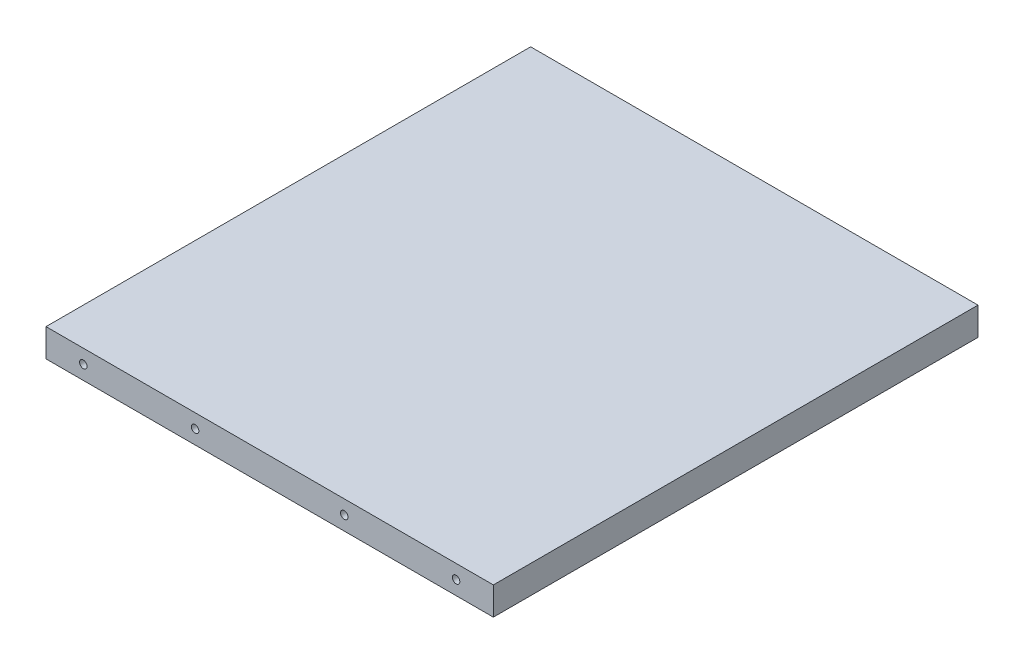
ISO-10303-21;
HEADER;
FILE_DESCRIPTION(('STEP AP214'),'2;1');
FILE_NAME('part.step','',(''),(''),'','','');
FILE_SCHEMA(('AUTOMOTIVE_DESIGN { 1 0 10303 214 1 1 1 1 }'));
ENDSEC;
DATA;
#1=APPLICATION_CONTEXT('core data for automotive mechanical design processes');
#2=APPLICATION_PROTOCOL_DEFINITION('international standard','automotive_design',2000,#1);
#3=PRODUCT_CONTEXT('',#1,'mechanical');
#4=PRODUCT('Part','Part','',(#3));
#5=PRODUCT_RELATED_PRODUCT_CATEGORY('part','',(#4));
#6=PRODUCT_DEFINITION_FORMATION('','',#4);
#7=PRODUCT_DEFINITION_CONTEXT('part definition',#1,'design');
#8=PRODUCT_DEFINITION('design','',#6,#7);
#9=PRODUCT_DEFINITION_SHAPE('','',#8);
#10=(LENGTH_UNIT() NAMED_UNIT(*) SI_UNIT(.MILLI.,.METRE.));
#11=(NAMED_UNIT(*) PLANE_ANGLE_UNIT() SI_UNIT($,.RADIAN.));
#12=(NAMED_UNIT(*) SI_UNIT($,.STERADIAN.) SOLID_ANGLE_UNIT());
#13=UNCERTAINTY_MEASURE_WITH_UNIT(LENGTH_MEASURE(1.E-05),#10,'distance_accuracy_value','');
#14=(GEOMETRIC_REPRESENTATION_CONTEXT(3) GLOBAL_UNCERTAINTY_ASSIGNED_CONTEXT((#13)) GLOBAL_UNIT_ASSIGNED_CONTEXT((#10,
#11,#12)) REPRESENTATION_CONTEXT('',''));
#15=CARTESIAN_POINT('',(0.,0.,0.));
#16=DIRECTION('',(0.,0.,1.));
#17=DIRECTION('',(1.,0.,0.));
#18=AXIS2_PLACEMENT_3D('',#15,#16,#17);
#19=CARTESIAN_POINT('',(152.4,9.525,165.1));
#20=DIRECTION('',(-1.,0.,0.));
#21=DIRECTION('',(0.,0.,1.));
#22=AXIS2_PLACEMENT_3D('',#19,#20,#21);
#23=PLANE('',#22);
#24=DIRECTION('',(0.,0.,-1.));
#25=VECTOR('',#24,1.);
#26=CARTESIAN_POINT('',(152.4,-9.525,165.1));
#27=LINE('',#26,#25);
#28=CARTESIAN_POINT('',(152.4,-9.525,165.1));
#29=VERTEX_POINT('',#28);
#30=CARTESIAN_POINT('',(152.4,-9.525,-165.1));
#31=VERTEX_POINT('',#30);
#32=EDGE_CURVE('E144',#29,#31,#27,.T.);
#33=ORIENTED_EDGE('',*,*,#32,.T.);
#34=DIRECTION('',(0.,-1.,0.));
#35=VECTOR('',#34,1.);
#36=CARTESIAN_POINT('',(152.4,9.525,-165.1));
#37=LINE('',#36,#35);
#38=CARTESIAN_POINT('',(152.4,9.525,-165.1));
#39=VERTEX_POINT('',#38);
#40=EDGE_CURVE('E11',#39,#31,#37,.T.);
#41=ORIENTED_EDGE('',*,*,#40,.F.);
#42=DIRECTION('',(0.,0.,-1.));
#43=VECTOR('',#42,1.);
#44=CARTESIAN_POINT('',(152.4,9.525,165.1));
#45=LINE('',#44,#43);
#46=CARTESIAN_POINT('',(152.4,9.525,165.1));
#47=VERTEX_POINT('',#46);
#48=EDGE_CURVE('E145',#47,#39,#45,.T.);
#49=ORIENTED_EDGE('',*,*,#48,.F.);
#50=DIRECTION('',(0.,-1.,0.));
#51=VECTOR('',#50,1.);
#52=CARTESIAN_POINT('',(152.4,9.525,165.1));
#53=LINE('',#52,#51);
#54=EDGE_CURVE('E155',#47,#29,#53,.T.);
#55=ORIENTED_EDGE('',*,*,#54,.T.);
#56=EDGE_LOOP('',(#33,#41,#49,#55));
#57=FACE_BOUND('',#56,.T.);
#58=ADVANCED_FACE('F42',(#57),#23,.F.);
#59=CARTESIAN_POINT('',(-152.4,9.525,-165.1));
#60=DIRECTION('',(0.,0.,1.));
#61=DIRECTION('',(1.,0.,0.));
#62=AXIS2_PLACEMENT_3D('',#59,#60,#61);
#63=PLANE('',#62);
#64=DIRECTION('',(-1.,0.,0.));
#65=VECTOR('',#64,1.);
#66=CARTESIAN_POINT('',(-152.4,-9.525,-165.1));
#67=LINE('',#66,#65);
#68=CARTESIAN_POINT('',(-152.4,-9.525,-165.1));
#69=VERTEX_POINT('',#68);
#70=EDGE_CURVE('E159',#31,#69,#67,.T.);
#71=ORIENTED_EDGE('',*,*,#70,.T.);
#72=DIRECTION('',(0.,-1.,0.));
#73=VECTOR('',#72,1.);
#74=CARTESIAN_POINT('',(-152.4,9.525,-165.1));
#75=LINE('',#74,#73);
#76=CARTESIAN_POINT('',(-152.4,9.525,-165.1));
#77=VERTEX_POINT('',#76);
#78=EDGE_CURVE('E51',#77,#69,#75,.T.);
#79=ORIENTED_EDGE('',*,*,#78,.F.);
#80=DIRECTION('',(-1.,0.,0.));
#81=VECTOR('',#80,1.);
#82=CARTESIAN_POINT('',(-152.4,9.525,-165.1));
#83=LINE('',#82,#81);
#84=EDGE_CURVE('E90',#39,#77,#83,.T.);
#85=ORIENTED_EDGE('',*,*,#84,.F.);
#86=ORIENTED_EDGE('',*,*,#40,.T.);
#87=EDGE_LOOP('',(#71,#79,#85,#86));
#88=FACE_BOUND('',#87,.T.);
#89=ADVANCED_FACE('F189',(#88),#63,.F.);
#90=CARTESIAN_POINT('',(-152.4,9.525,165.1));
#91=DIRECTION('',(1.,0.,0.));
#92=DIRECTION('',(0.,0.,-1.));
#93=AXIS2_PLACEMENT_3D('',#90,#91,#92);
#94=PLANE('',#93);
#95=DIRECTION('',(0.,0.,1.));
#96=VECTOR('',#95,1.);
#97=CARTESIAN_POINT('',(-152.4,-9.525,165.1));
#98=LINE('',#97,#96);
#99=CARTESIAN_POINT('',(-152.4,-9.525,165.1));
#100=VERTEX_POINT('',#99);
#101=EDGE_CURVE('E77',#69,#100,#98,.T.);
#102=ORIENTED_EDGE('',*,*,#101,.T.);
#103=DIRECTION('',(0.,-1.,0.));
#104=VECTOR('',#103,1.);
#105=CARTESIAN_POINT('',(-152.4,9.525,165.1));
#106=LINE('',#105,#104);
#107=CARTESIAN_POINT('',(-152.4,9.525,165.1));
#108=VERTEX_POINT('',#107);
#109=EDGE_CURVE('E168',#108,#100,#106,.T.);
#110=ORIENTED_EDGE('',*,*,#109,.F.);
#111=DIRECTION('',(0.,0.,1.));
#112=VECTOR('',#111,1.);
#113=CARTESIAN_POINT('',(-152.4,9.525,165.1));
#114=LINE('',#113,#112);
#115=EDGE_CURVE('E150',#77,#108,#114,.T.);
#116=ORIENTED_EDGE('',*,*,#115,.F.);
#117=ORIENTED_EDGE('',*,*,#78,.T.);
#118=EDGE_LOOP('',(#102,#110,#116,#117));
#119=FACE_BOUND('',#118,.T.);
#120=ADVANCED_FACE('F172',(#119),#94,.F.);
#121=CARTESIAN_POINT('',(-152.4,9.525,165.1));
#122=DIRECTION('',(0.,0.,-1.));
#123=DIRECTION('',(-1.,0.,0.));
#124=AXIS2_PLACEMENT_3D('',#121,#122,#123);
#125=PLANE('',#124);
#126=CARTESIAN_POINT('',(127.,0.,165.1));
#127=DIRECTION('',(0.,0.,1.));
#128=DIRECTION('',(1.,0.,0.));
#129=AXIS2_PLACEMENT_3D('',#126,#127,#128);
#130=CIRCLE('',#129,2.55269999999999);
#131=CARTESIAN_POINT('',(129.5527,0.,165.1));
#132=VERTEX_POINT('',#131);
#133=EDGE_CURVE('E115',#132,#132,#130,.T.);
#134=ORIENTED_EDGE('',*,*,#133,.F.);
#135=EDGE_LOOP('',(#134));
#136=FACE_BOUND('',#135,.T.);
#137=CARTESIAN_POINT('',(50.8,0.,165.1));
#138=DIRECTION('',(0.,0.,1.));
#139=DIRECTION('',(1.,0.,0.));
#140=AXIS2_PLACEMENT_3D('',#137,#138,#139);
#141=CIRCLE('',#140,2.55269999999999);
#142=CARTESIAN_POINT('',(53.3527,0.,165.1));
#143=VERTEX_POINT('',#142);
#144=EDGE_CURVE('E114',#143,#143,#141,.T.);
#145=ORIENTED_EDGE('',*,*,#144,.F.);
#146=EDGE_LOOP('',(#145));
#147=FACE_BOUND('',#146,.T.);
#148=CARTESIAN_POINT('',(-50.8,0.,165.1));
#149=DIRECTION('',(0.,0.,1.));
#150=DIRECTION('',(1.,0.,0.));
#151=AXIS2_PLACEMENT_3D('',#148,#149,#150);
#152=CIRCLE('',#151,2.55269999999999);
#153=CARTESIAN_POINT('',(-48.2473,0.,165.1));
#154=VERTEX_POINT('',#153);
#155=EDGE_CURVE('E128',#154,#154,#152,.T.);
#156=ORIENTED_EDGE('',*,*,#155,.F.);
#157=EDGE_LOOP('',(#156));
#158=FACE_BOUND('',#157,.T.);
#159=CARTESIAN_POINT('',(-127.,0.,165.1));
#160=DIRECTION('',(0.,0.,1.));
#161=DIRECTION('',(1.,0.,0.));
#162=AXIS2_PLACEMENT_3D('',#159,#160,#161);
#163=CIRCLE('',#162,2.55269999999999);
#164=CARTESIAN_POINT('',(-124.4473,0.,165.1));
#165=VERTEX_POINT('',#164);
#166=EDGE_CURVE('E136',#165,#165,#163,.T.);
#167=ORIENTED_EDGE('',*,*,#166,.F.);
#168=EDGE_LOOP('',(#167));
#169=FACE_BOUND('',#168,.T.);
#170=DIRECTION('',(1.,0.,0.));
#171=VECTOR('',#170,1.);
#172=CARTESIAN_POINT('',(-152.4,-9.525,165.1));
#173=LINE('',#172,#171);
#174=EDGE_CURVE('E83',#100,#29,#173,.T.);
#175=ORIENTED_EDGE('',*,*,#174,.T.);
#176=ORIENTED_EDGE('',*,*,#54,.F.);
#177=DIRECTION('',(1.,0.,0.));
#178=VECTOR('',#177,1.);
#179=CARTESIAN_POINT('',(-152.4,9.525,165.1));
#180=LINE('',#179,#178);
#181=EDGE_CURVE('E59',#108,#47,#180,.T.);
#182=ORIENTED_EDGE('',*,*,#181,.F.);
#183=ORIENTED_EDGE('',*,*,#109,.T.);
#184=EDGE_LOOP('',(#175,#176,#182,#183));
#185=FACE_BOUND('',#184,.T.);
#186=ADVANCED_FACE('F179',(#136,#147,#158,#169,#185),#125,.F.);
#187=CARTESIAN_POINT('',(0.,9.525,0.));
#188=DIRECTION('',(0.,-1.,0.));
#189=DIRECTION('',(0.,0.,-1.));
#190=AXIS2_PLACEMENT_3D('',#187,#188,#189);
#191=PLANE('',#190);
#192=ORIENTED_EDGE('',*,*,#48,.T.);
#193=ORIENTED_EDGE('',*,*,#84,.T.);
#194=ORIENTED_EDGE('',*,*,#115,.T.);
#195=ORIENTED_EDGE('',*,*,#181,.T.);
#196=EDGE_LOOP('',(#192,#193,#194,#195));
#197=FACE_BOUND('',#196,.T.);
#198=ADVANCED_FACE('F181',(#197),#191,.F.);
#199=CARTESIAN_POINT('',(0.,-9.525,0.));
#200=DIRECTION('',(0.,-1.,0.));
#201=DIRECTION('',(0.,0.,-1.));
#202=AXIS2_PLACEMENT_3D('',#199,#200,#201);
#203=PLANE('',#202);
#204=ORIENTED_EDGE('',*,*,#32,.F.);
#205=ORIENTED_EDGE('',*,*,#174,.F.);
#206=ORIENTED_EDGE('',*,*,#101,.F.);
#207=ORIENTED_EDGE('',*,*,#70,.F.);
#208=EDGE_LOOP('',(#204,#205,#206,#207));
#209=FACE_BOUND('',#208,.T.);
#210=ADVANCED_FACE('F175',(#209),#203,.T.);
#211=CARTESIAN_POINT('',(-127.,0.,127.));
#212=DIRECTION('',(0.,0.,1.));
#213=DIRECTION('',(1.,0.,0.));
#214=AXIS2_PLACEMENT_3D('',#211,#212,#213);
#215=CONICAL_SURFACE('',#214,2.55269999999995,1.02974425867664);
#216=CARTESIAN_POINT('',(-127.,0.,125.466183097808));
#217=VERTEX_POINT('',#216);
#218=VERTEX_LOOP('',#217);
#219=FACE_BOUND('',#218,.T.);
#220=CARTESIAN_POINT('',(-127.,0.,127.));
#221=DIRECTION('',(0.,0.,1.));
#222=DIRECTION('',(1.,0.,0.));
#223=AXIS2_PLACEMENT_3D('',#220,#221,#222);
#224=CIRCLE('',#223,2.55269999999995);
#225=CARTESIAN_POINT('',(-124.4473,0.,127.));
#226=VERTEX_POINT('',#225);
#227=EDGE_CURVE('E140',#226,#226,#224,.T.);
#228=ORIENTED_EDGE('',*,*,#227,.T.);
#229=EDGE_LOOP('',(#228));
#230=FACE_BOUND('',#229,.T.);
#231=ADVANCED_FACE('F220',(#219,#230),#215,.F.);
#232=CARTESIAN_POINT('',(-127.,0.,165.1));
#233=DIRECTION('',(0.,0.,1.));
#234=DIRECTION('',(1.,0.,0.));
#235=AXIS2_PLACEMENT_3D('',#232,#233,#234);
#236=CYLINDRICAL_SURFACE('',#235,2.55269999999997);
#237=ORIENTED_EDGE('',*,*,#227,.F.);
#238=EDGE_LOOP('',(#237));
#239=FACE_BOUND('',#238,.T.);
#240=ORIENTED_EDGE('',*,*,#166,.T.);
#241=EDGE_LOOP('',(#240));
#242=FACE_BOUND('',#241,.T.);
#243=ADVANCED_FACE('F236',(#239,#242),#236,.F.);
#244=CARTESIAN_POINT('',(-50.8,0.,127.));
#245=DIRECTION('',(0.,0.,1.));
#246=DIRECTION('',(1.,0.,0.));
#247=AXIS2_PLACEMENT_3D('',#244,#245,#246);
#248=CONICAL_SURFACE('',#247,2.55269999999996,1.02974425867664);
#249=CARTESIAN_POINT('',(-50.8,0.,125.466183097808));
#250=VERTEX_POINT('',#249);
#251=VERTEX_LOOP('',#250);
#252=FACE_BOUND('',#251,.T.);
#253=CARTESIAN_POINT('',(-50.8,0.,127.));
#254=DIRECTION('',(0.,0.,1.));
#255=DIRECTION('',(1.,0.,0.));
#256=AXIS2_PLACEMENT_3D('',#253,#254,#255);
#257=CIRCLE('',#256,2.55269999999996);
#258=CARTESIAN_POINT('',(-48.2473000000001,0.,127.));
#259=VERTEX_POINT('',#258);
#260=EDGE_CURVE('E132',#259,#259,#257,.T.);
#261=ORIENTED_EDGE('',*,*,#260,.T.);
#262=EDGE_LOOP('',(#261));
#263=FACE_BOUND('',#262,.T.);
#264=ADVANCED_FACE('F247',(#252,#263),#248,.F.);
#265=CARTESIAN_POINT('',(-50.8,0.,165.1));
#266=DIRECTION('',(0.,0.,1.));
#267=DIRECTION('',(1.,0.,0.));
#268=AXIS2_PLACEMENT_3D('',#265,#266,#267);
#269=CYLINDRICAL_SURFACE('',#268,2.55269999999997);
#270=ORIENTED_EDGE('',*,*,#260,.F.);
#271=EDGE_LOOP('',(#270));
#272=FACE_BOUND('',#271,.T.);
#273=ORIENTED_EDGE('',*,*,#155,.T.);
#274=EDGE_LOOP('',(#273));
#275=FACE_BOUND('',#274,.T.);
#276=ADVANCED_FACE('F258',(#272,#275),#269,.F.);
#277=CARTESIAN_POINT('',(50.8,0.,127.));
#278=DIRECTION('',(0.,0.,1.));
#279=DIRECTION('',(1.,0.,0.));
#280=AXIS2_PLACEMENT_3D('',#277,#278,#279);
#281=CONICAL_SURFACE('',#280,2.55269999999996,1.02974425867664);
#282=CARTESIAN_POINT('',(50.8,0.,125.466183097808));
#283=VERTEX_POINT('',#282);
#284=VERTEX_LOOP('',#283);
#285=FACE_BOUND('',#284,.T.);
#286=CARTESIAN_POINT('',(50.8,0.,127.));
#287=DIRECTION('',(0.,0.,1.));
#288=DIRECTION('',(1.,0.,0.));
#289=AXIS2_PLACEMENT_3D('',#286,#287,#288);
#290=CIRCLE('',#289,2.55269999999996);
#291=CARTESIAN_POINT('',(53.3526999999999,0.,127.));
#292=VERTEX_POINT('',#291);
#293=EDGE_CURVE('E120',#292,#292,#290,.T.);
#294=ORIENTED_EDGE('',*,*,#293,.T.);
#295=EDGE_LOOP('',(#294));
#296=FACE_BOUND('',#295,.T.);
#297=ADVANCED_FACE('F268',(#285,#296),#281,.F.);
#298=CARTESIAN_POINT('',(50.8,0.,165.1));
#299=DIRECTION('',(0.,0.,1.));
#300=DIRECTION('',(1.,0.,0.));
#301=AXIS2_PLACEMENT_3D('',#298,#299,#300);
#302=CYLINDRICAL_SURFACE('',#301,2.55269999999997);
#303=ORIENTED_EDGE('',*,*,#293,.F.);
#304=EDGE_LOOP('',(#303));
#305=FACE_BOUND('',#304,.T.);
#306=ORIENTED_EDGE('',*,*,#144,.T.);
#307=EDGE_LOOP('',(#306));
#308=FACE_BOUND('',#307,.T.);
#309=ADVANCED_FACE('F107',(#305,#308),#302,.F.);
#310=CARTESIAN_POINT('',(127.,0.,127.));
#311=DIRECTION('',(0.,0.,1.));
#312=DIRECTION('',(1.,0.,0.));
#313=AXIS2_PLACEMENT_3D('',#310,#311,#312);
#314=CONICAL_SURFACE('',#313,2.55269999999996,1.02974425867664);
#315=CARTESIAN_POINT('',(127.,0.,125.466183097808));
#316=VERTEX_POINT('',#315);
#317=VERTEX_LOOP('',#316);
#318=FACE_BOUND('',#317,.T.);
#319=CARTESIAN_POINT('',(127.,0.,127.));
#320=DIRECTION('',(0.,0.,1.));
#321=DIRECTION('',(1.,0.,0.));
#322=AXIS2_PLACEMENT_3D('',#319,#320,#321);
#323=CIRCLE('',#322,2.55269999999996);
#324=CARTESIAN_POINT('',(129.5527,0.,127.));
#325=VERTEX_POINT('',#324);
#326=EDGE_CURVE('E111',#325,#325,#323,.T.);
#327=ORIENTED_EDGE('',*,*,#326,.T.);
#328=EDGE_LOOP('',(#327));
#329=FACE_BOUND('',#328,.T.);
#330=ADVANCED_FACE('F103',(#318,#329),#314,.F.);
#331=CARTESIAN_POINT('',(127.,0.,165.1));
#332=DIRECTION('',(0.,0.,1.));
#333=DIRECTION('',(1.,0.,0.));
#334=AXIS2_PLACEMENT_3D('',#331,#332,#333);
#335=CYLINDRICAL_SURFACE('',#334,2.55269999999998);
#336=ORIENTED_EDGE('',*,*,#326,.F.);
#337=EDGE_LOOP('',(#336));
#338=FACE_BOUND('',#337,.T.);
#339=ORIENTED_EDGE('',*,*,#133,.T.);
#340=EDGE_LOOP('',(#339));
#341=FACE_BOUND('',#340,.T.);
#342=ADVANCED_FACE('F106',(#338,#341),#335,.F.);
#343=CLOSED_SHELL('',(#58,#89,#120,#186,#198,#210,#231,#243,#264,#276,#297,#309,#330,#342));
#344=MANIFOLD_SOLID_BREP('B2',#343);
#345=ADVANCED_BREP_SHAPE_REPRESENTATION('',(#18,#344),#14);
#346=SHAPE_DEFINITION_REPRESENTATION(#9,#345);
ENDSEC;
END-ISO-10303-21;
